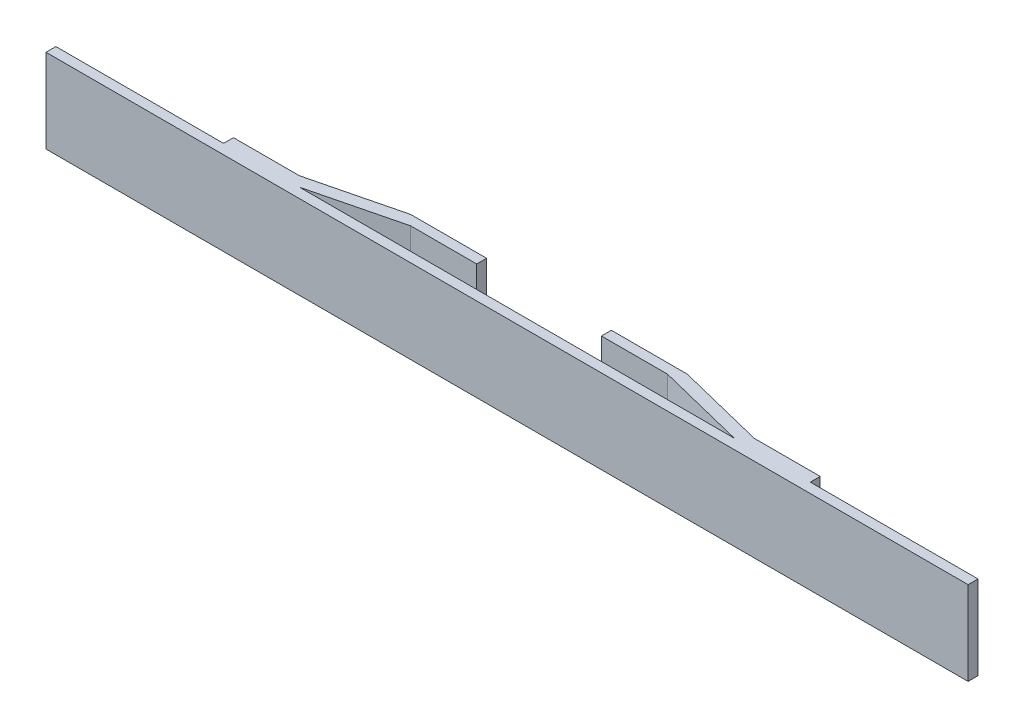
ISO-10303-21;
HEADER;
FILE_DESCRIPTION(('STEP AP214'),'2;1');
FILE_NAME('part.step','',(''),(''),'','','');
FILE_SCHEMA(('AUTOMOTIVE_DESIGN { 1 0 10303 214 1 1 1 1 }'));
ENDSEC;
DATA;
#1=APPLICATION_CONTEXT('core data for automotive mechanical design processes');
#2=APPLICATION_PROTOCOL_DEFINITION('international standard','automotive_design',2000,#1);
#3=PRODUCT_CONTEXT('',#1,'mechanical');
#4=PRODUCT('Part','Part','',(#3));
#5=PRODUCT_RELATED_PRODUCT_CATEGORY('part','',(#4));
#6=PRODUCT_DEFINITION_FORMATION('','',#4);
#7=PRODUCT_DEFINITION_CONTEXT('part definition',#1,'design');
#8=PRODUCT_DEFINITION('design','',#6,#7);
#9=PRODUCT_DEFINITION_SHAPE('','',#8);
#10=(LENGTH_UNIT() NAMED_UNIT(*) SI_UNIT(.MILLI.,.METRE.));
#11=(NAMED_UNIT(*) PLANE_ANGLE_UNIT() SI_UNIT($,.RADIAN.));
#12=(NAMED_UNIT(*) SI_UNIT($,.STERADIAN.) SOLID_ANGLE_UNIT());
#13=UNCERTAINTY_MEASURE_WITH_UNIT(LENGTH_MEASURE(1.E-05),#10,'distance_accuracy_value','');
#14=(GEOMETRIC_REPRESENTATION_CONTEXT(3) GLOBAL_UNCERTAINTY_ASSIGNED_CONTEXT((#13)) GLOBAL_UNIT_ASSIGNED_CONTEXT((#10,
#11,#12)) REPRESENTATION_CONTEXT('',''));
#15=CARTESIAN_POINT('',(0.,0.,0.));
#16=DIRECTION('',(0.,0.,1.));
#17=DIRECTION('',(1.,0.,0.));
#18=AXIS2_PLACEMENT_3D('',#15,#16,#17);
#19=CARTESIAN_POINT('',(-13.3330218068536,-14.8364485981308,9.7));
#20=DIRECTION('',(0.,0.,1.));
#21=DIRECTION('',(1.,0.,0.));
#22=AXIS2_PLACEMENT_3D('',#19,#20,#21);
#23=PLANE('',#22);
#24=DIRECTION('',(0.,1.,0.));
#25=VECTOR('',#24,1.);
#26=CARTESIAN_POINT('',(37.4669781931464,10.5635514018692,9.7));
#27=LINE('',#26,#25);
#28=CARTESIAN_POINT('',(37.4669781931464,-14.8364485981308,9.7));
#29=VERTEX_POINT('',#28);
#30=CARTESIAN_POINT('',(37.4669781931464,10.5635514018692,9.7));
#31=VERTEX_POINT('',#30);
#32=EDGE_CURVE('E239',#29,#31,#27,.T.);
#33=ORIENTED_EDGE('',*,*,#32,.F.);
#34=DIRECTION('',(1.,0.,0.));
#35=VECTOR('',#34,1.);
#36=CARTESIAN_POINT('',(-13.3330218068536,-14.8364485981308,9.7));
#37=LINE('',#36,#35);
#38=CARTESIAN_POINT('',(-13.3330218068536,-14.8364485981308,9.7));
#39=VERTEX_POINT('',#38);
#40=EDGE_CURVE('E198',#39,#29,#37,.T.);
#41=ORIENTED_EDGE('',*,*,#40,.F.);
#42=DIRECTION('',(0.,1.,0.));
#43=VECTOR('',#42,1.);
#44=CARTESIAN_POINT('',(-13.3330218068536,-14.8364485981308,9.7));
#45=LINE('',#44,#43);
#46=CARTESIAN_POINT('',(-13.3330218068536,10.5635514018692,9.7));
#47=VERTEX_POINT('',#46);
#48=EDGE_CURVE('E196',#39,#47,#45,.T.);
#49=ORIENTED_EDGE('',*,*,#48,.T.);
#50=DIRECTION('',(1.,0.,0.));
#51=VECTOR('',#50,1.);
#52=CARTESIAN_POINT('',(-13.3330218068536,10.5635514018692,9.7));
#53=LINE('',#52,#51);
#54=EDGE_CURVE('E186',#47,#31,#53,.T.);
#55=ORIENTED_EDGE('',*,*,#54,.T.);
#56=EDGE_LOOP('',(#33,#41,#49,#55));
#57=FACE_BOUND('',#56,.T.);
#58=ADVANCED_FACE('F34',(#57),#23,.F.);
#59=CARTESIAN_POINT('',(60.4669781931464,-14.8364485981308,9.7));
#60=VERTEX_POINT('',#59);
#61=CARTESIAN_POINT('',(192.266978193146,-14.8364485981308,9.7));
#62=VERTEX_POINT('',#61);
#63=EDGE_CURVE('E206',#60,#62,#37,.T.);
#64=ORIENTED_EDGE('',*,*,#63,.F.);
#65=DIRECTION('',(0.,1.,0.));
#66=VECTOR('',#65,1.);
#67=CARTESIAN_POINT('',(60.4669781931464,-14.8364485981308,9.7));
#68=LINE('',#67,#66);
#69=CARTESIAN_POINT('',(60.4669781931464,10.5635514018692,9.7));
#70=VERTEX_POINT('',#69);
#71=EDGE_CURVE('E281',#60,#70,#68,.T.);
#72=ORIENTED_EDGE('',*,*,#71,.T.);
#73=CARTESIAN_POINT('',(192.266978193146,10.5635514018692,9.7));
#74=VERTEX_POINT('',#73);
#75=EDGE_CURVE('E202',#70,#74,#53,.T.);
#76=ORIENTED_EDGE('',*,*,#75,.T.);
#77=DIRECTION('',(0.,1.,0.));
#78=VECTOR('',#77,1.);
#79=CARTESIAN_POINT('',(192.266978193146,-14.8364485981308,9.7));
#80=LINE('',#79,#78);
#81=EDGE_CURVE('E249',#62,#74,#80,.T.);
#82=ORIENTED_EDGE('',*,*,#81,.F.);
#83=EDGE_LOOP('',(#64,#72,#76,#82));
#84=FACE_BOUND('',#83,.T.);
#85=ADVANCED_FACE('F334',(#84),#23,.F.);
#86=DIRECTION('',(0.,-1.,0.));
#87=VECTOR('',#86,1.);
#88=CARTESIAN_POINT('',(215.266978193146,10.5635514018692,9.7));
#89=LINE('',#88,#87);
#90=CARTESIAN_POINT('',(215.266978193146,10.5635514018692,9.7));
#91=VERTEX_POINT('',#90);
#92=CARTESIAN_POINT('',(215.266978193146,-14.8364485981308,9.7));
#93=VERTEX_POINT('',#92);
#94=EDGE_CURVE('E218',#91,#93,#89,.T.);
#95=ORIENTED_EDGE('',*,*,#94,.F.);
#96=CARTESIAN_POINT('',(266.066978193146,10.5635514018692,9.69999999999999));
#97=VERTEX_POINT('',#96);
#98=EDGE_CURVE('E203',#91,#97,#53,.T.);
#99=ORIENTED_EDGE('',*,*,#98,.T.);
#100=DIRECTION('',(0.,1.,0.));
#101=VECTOR('',#100,1.);
#102=CARTESIAN_POINT('',(266.066978193146,-14.8364485981308,9.69999999999999));
#103=LINE('',#102,#101);
#104=CARTESIAN_POINT('',(266.066978193146,-14.8364485981308,9.69999999999999));
#105=VERTEX_POINT('',#104);
#106=EDGE_CURVE('E193',#105,#97,#103,.T.);
#107=ORIENTED_EDGE('',*,*,#106,.F.);
#108=EDGE_CURVE('E201',#93,#105,#37,.T.);
#109=ORIENTED_EDGE('',*,*,#108,.F.);
#110=EDGE_LOOP('',(#95,#99,#107,#109));
#111=FACE_BOUND('',#110,.T.);
#112=ADVANCED_FACE('F330',(#111),#23,.F.);
#113=CARTESIAN_POINT('',(-26.0330218068536,-14.8364485981308,12.7));
#114=DIRECTION('',(0.,1.,0.));
#115=DIRECTION('',(-1.,0.,0.));
#116=AXIS2_PLACEMENT_3D('',#113,#114,#115);
#117=PLANE('',#116);
#118=DIRECTION('',(1.,0.,0.));
#119=VECTOR('',#118,1.);
#120=CARTESIAN_POINT('',(-26.0330218068536,-14.8364485981308,12.7));
#121=LINE('',#120,#119);
#122=CARTESIAN_POINT('',(-13.3330218068536,-14.8364485981308,12.7));
#123=VERTEX_POINT('',#122);
#124=CARTESIAN_POINT('',(266.066978193146,-14.8364485981308,12.7));
#125=VERTEX_POINT('',#124);
#126=EDGE_CURVE('E191',#123,#125,#121,.T.);
#127=ORIENTED_EDGE('',*,*,#126,.F.);
#128=DIRECTION('',(0.,0.,1.));
#129=VECTOR('',#128,1.);
#130=CARTESIAN_POINT('',(-13.3330218068536,-14.8364485981308,0.));
#131=LINE('',#130,#129);
#132=EDGE_CURVE('E174',#39,#123,#131,.T.);
#133=ORIENTED_EDGE('',*,*,#132,.F.);
#134=ORIENTED_EDGE('',*,*,#40,.T.);
#135=DIRECTION('',(0.,0.,1.));
#136=VECTOR('',#135,1.);
#137=CARTESIAN_POINT('',(37.4669781931464,-14.8364485981308,0.));
#138=LINE('',#137,#136);
#139=CARTESIAN_POINT('',(37.4669781931464,-14.8364485981308,6.7));
#140=VERTEX_POINT('',#139);
#141=EDGE_CURVE('E236',#140,#29,#138,.T.);
#142=ORIENTED_EDGE('',*,*,#141,.F.);
#143=DIRECTION('',(1.,0.,0.));
#144=VECTOR('',#143,1.);
#145=CARTESIAN_POINT('',(37.4669781931464,-14.8364485981308,6.7));
#146=LINE('',#145,#144);
#147=CARTESIAN_POINT('',(57.4669781931464,-14.8364485981308,6.7));
#148=VERTEX_POINT('',#147);
#149=EDGE_CURVE('E310',#140,#148,#146,.T.);
#150=ORIENTED_EDGE('',*,*,#149,.T.);
#151=DIRECTION('',(0.970563929002576,0.,-0.24084364164138));
#152=VECTOR('',#151,1.);
#153=CARTESIAN_POINT('',(57.4669781931464,-14.8364485981308,6.7));
#154=LINE('',#153,#152);
#155=CARTESIAN_POINT('',(84.4669781931464,-14.8364485981308,0.));
#156=VERTEX_POINT('',#155);
#157=EDGE_CURVE('E306',#148,#156,#154,.T.);
#158=ORIENTED_EDGE('',*,*,#157,.T.);
#159=DIRECTION('',(-1.,0.,0.));
#160=VECTOR('',#159,1.);
#161=CARTESIAN_POINT('',(37.4669781931464,-14.8364485981308,0.));
#162=LINE('',#161,#160);
#163=CARTESIAN_POINT('',(107.466978193146,-14.8364485981308,0.));
#164=VERTEX_POINT('',#163);
#165=EDGE_CURVE('E238',#164,#156,#162,.T.);
#166=ORIENTED_EDGE('',*,*,#165,.F.);
#167=DIRECTION('',(0.,0.,1.));
#168=VECTOR('',#167,1.);
#169=CARTESIAN_POINT('',(107.466978193146,-14.8364485981308,0.));
#170=LINE('',#169,#168);
#171=CARTESIAN_POINT('',(107.466978193146,-14.8364485981308,3.));
#172=VERTEX_POINT('',#171);
#173=EDGE_CURVE('E233',#164,#172,#170,.T.);
#174=ORIENTED_EDGE('',*,*,#173,.T.);
#175=DIRECTION('',(-1.,0.,0.));
#176=VECTOR('',#175,1.);
#177=CARTESIAN_POINT('',(107.466978193146,-14.8364485981308,3.));
#178=LINE('',#177,#176);
#179=CARTESIAN_POINT('',(87.4669781931464,-14.8364485981308,3.));
#180=VERTEX_POINT('',#179);
#181=EDGE_CURVE('E49',#172,#180,#178,.T.);
#182=ORIENTED_EDGE('',*,*,#181,.T.);
#183=DIRECTION('',(-0.970563929002577,0.,0.24084364164138));
#184=VECTOR('',#183,1.);
#185=CARTESIAN_POINT('',(87.4669781931464,-14.8364485981308,3.));
#186=LINE('',#185,#184);
#187=EDGE_CURVE('E289',#180,#60,#186,.T.);
#188=ORIENTED_EDGE('',*,*,#187,.T.);
#189=ORIENTED_EDGE('',*,*,#63,.T.);
#190=DIRECTION('',(-0.970563929002576,0.,-0.24084364164138));
#191=VECTOR('',#190,1.);
#192=CARTESIAN_POINT('',(192.266978193146,-14.8364485981308,9.7));
#193=LINE('',#192,#191);
#194=CARTESIAN_POINT('',(165.266978193146,-14.8364485981308,3.));
#195=VERTEX_POINT('',#194);
#196=EDGE_CURVE('E259',#62,#195,#193,.T.);
#197=ORIENTED_EDGE('',*,*,#196,.T.);
#198=DIRECTION('',(-1.,0.,0.));
#199=VECTOR('',#198,1.);
#200=CARTESIAN_POINT('',(165.266978193146,-14.8364485981308,3.));
#201=LINE('',#200,#199);
#202=CARTESIAN_POINT('',(145.266978193146,-14.8364485981308,3.));
#203=VERTEX_POINT('',#202);
#204=EDGE_CURVE('E253',#195,#203,#201,.T.);
#205=ORIENTED_EDGE('',*,*,#204,.T.);
#206=DIRECTION('',(0.,0.,1.));
#207=VECTOR('',#206,1.);
#208=CARTESIAN_POINT('',(145.266978193146,-14.8364485981308,0.));
#209=LINE('',#208,#207);
#210=CARTESIAN_POINT('',(145.266978193146,-14.8364485981308,0.));
#211=VERTEX_POINT('',#210);
#212=EDGE_CURVE('E214',#211,#203,#209,.T.);
#213=ORIENTED_EDGE('',*,*,#212,.F.);
#214=DIRECTION('',(-1.,0.,0.));
#215=VECTOR('',#214,1.);
#216=CARTESIAN_POINT('',(145.266978193146,-14.8364485981308,0.));
#217=LINE('',#216,#215);
#218=CARTESIAN_POINT('',(168.266978193146,-14.8364485981308,0.));
#219=VERTEX_POINT('',#218);
#220=EDGE_CURVE('E217',#219,#211,#217,.T.);
#221=ORIENTED_EDGE('',*,*,#220,.F.);
#222=DIRECTION('',(0.970563929002576,0.,0.24084364164138));
#223=VECTOR('',#222,1.);
#224=CARTESIAN_POINT('',(195.266978193146,-14.8364485981308,6.7));
#225=LINE('',#224,#223);
#226=CARTESIAN_POINT('',(195.266978193146,-14.8364485981308,6.7));
#227=VERTEX_POINT('',#226);
#228=EDGE_CURVE('E277',#219,#227,#225,.T.);
#229=ORIENTED_EDGE('',*,*,#228,.T.);
#230=DIRECTION('',(1.,0.,0.));
#231=VECTOR('',#230,1.);
#232=CARTESIAN_POINT('',(215.266978193146,-14.8364485981308,6.69999999999999));
#233=LINE('',#232,#231);
#234=CARTESIAN_POINT('',(215.266978193146,-14.8364485981308,6.69999999999999));
#235=VERTEX_POINT('',#234);
#236=EDGE_CURVE('E271',#227,#235,#233,.T.);
#237=ORIENTED_EDGE('',*,*,#236,.T.);
#238=DIRECTION('',(0.,0.,1.));
#239=VECTOR('',#238,1.);
#240=CARTESIAN_POINT('',(215.266978193146,-14.8364485981308,0.));
#241=LINE('',#240,#239);
#242=EDGE_CURVE('E212',#235,#93,#241,.T.);
#243=ORIENTED_EDGE('',*,*,#242,.T.);
#244=ORIENTED_EDGE('',*,*,#108,.T.);
#245=DIRECTION('',(0.,0.,1.));
#246=VECTOR('',#245,1.);
#247=CARTESIAN_POINT('',(266.066978193146,-14.8364485981308,0.));
#248=LINE('',#247,#246);
#249=EDGE_CURVE('E318',#105,#125,#248,.T.);
#250=ORIENTED_EDGE('',*,*,#249,.T.);
#251=EDGE_LOOP('',(#127,#133,#134,#142,#150,#158,#166,#174,#182,#188,#189,#197,#205,#213,#221,
#229,#237,#243,#244,#250));
#252=FACE_BOUND('',#251,.T.);
#253=ADVANCED_FACE('F36',(#252),#117,.F.);
#254=CARTESIAN_POINT('',(-26.0330218068536,10.5635514018692,12.7));
#255=DIRECTION('',(0.,1.,0.));
#256=DIRECTION('',(0.,0.,1.));
#257=AXIS2_PLACEMENT_3D('',#254,#255,#256);
#258=PLANE('',#257);
#259=DIRECTION('',(0.,0.,1.));
#260=VECTOR('',#259,1.);
#261=CARTESIAN_POINT('',(-13.3330218068536,10.5635514018692,0.));
#262=LINE('',#261,#260);
#263=CARTESIAN_POINT('',(-13.3330218068536,10.5635514018692,12.7));
#264=VERTEX_POINT('',#263);
#265=EDGE_CURVE('E171',#47,#264,#262,.T.);
#266=ORIENTED_EDGE('',*,*,#265,.T.);
#267=DIRECTION('',(1.,0.,0.));
#268=VECTOR('',#267,1.);
#269=CARTESIAN_POINT('',(-26.0330218068536,10.5635514018692,12.7));
#270=LINE('',#269,#268);
#271=CARTESIAN_POINT('',(266.066978193146,10.5635514018692,12.7));
#272=VERTEX_POINT('',#271);
#273=EDGE_CURVE('E184',#264,#272,#270,.T.);
#274=ORIENTED_EDGE('',*,*,#273,.T.);
#275=DIRECTION('',(0.,0.,1.));
#276=VECTOR('',#275,1.);
#277=CARTESIAN_POINT('',(266.066978193146,10.5635514018692,0.));
#278=LINE('',#277,#276);
#279=EDGE_CURVE('E187',#97,#272,#278,.T.);
#280=ORIENTED_EDGE('',*,*,#279,.F.);
#281=ORIENTED_EDGE('',*,*,#98,.F.);
#282=DIRECTION('',(0.,0.,1.));
#283=VECTOR('',#282,1.);
#284=CARTESIAN_POINT('',(215.266978193146,10.5635514018692,0.));
#285=LINE('',#284,#283);
#286=CARTESIAN_POINT('',(215.266978193146,10.5635514018692,6.69999999999999));
#287=VERTEX_POINT('',#286);
#288=EDGE_CURVE('E210',#287,#91,#285,.T.);
#289=ORIENTED_EDGE('',*,*,#288,.F.);
#290=DIRECTION('',(1.,0.,0.));
#291=VECTOR('',#290,1.);
#292=CARTESIAN_POINT('',(215.266978193146,10.5635514018692,6.69999999999999));
#293=LINE('',#292,#291);
#294=CARTESIAN_POINT('',(195.266978193146,10.5635514018692,6.7));
#295=VERTEX_POINT('',#294);
#296=EDGE_CURVE('E275',#295,#287,#293,.T.);
#297=ORIENTED_EDGE('',*,*,#296,.F.);
#298=DIRECTION('',(0.970563929002576,0.,0.24084364164138));
#299=VECTOR('',#298,1.);
#300=CARTESIAN_POINT('',(195.266978193146,10.5635514018692,6.7));
#301=LINE('',#300,#299);
#302=CARTESIAN_POINT('',(168.266978193146,10.5635514018692,0.));
#303=VERTEX_POINT('',#302);
#304=EDGE_CURVE('E278',#303,#295,#301,.T.);
#305=ORIENTED_EDGE('',*,*,#304,.F.);
#306=DIRECTION('',(1.,0.,0.));
#307=VECTOR('',#306,1.);
#308=CARTESIAN_POINT('',(145.266978193146,10.5635514018692,0.));
#309=LINE('',#308,#307);
#310=CARTESIAN_POINT('',(145.266978193146,10.5635514018692,0.));
#311=VERTEX_POINT('',#310);
#312=EDGE_CURVE('E224',#311,#303,#309,.T.);
#313=ORIENTED_EDGE('',*,*,#312,.F.);
#314=DIRECTION('',(0.,0.,1.));
#315=VECTOR('',#314,1.);
#316=CARTESIAN_POINT('',(145.266978193146,10.5635514018692,0.));
#317=LINE('',#316,#315);
#318=CARTESIAN_POINT('',(145.266978193146,10.5635514018692,3.));
#319=VERTEX_POINT('',#318);
#320=EDGE_CURVE('E207',#311,#319,#317,.T.);
#321=ORIENTED_EDGE('',*,*,#320,.T.);
#322=DIRECTION('',(-1.,0.,0.));
#323=VECTOR('',#322,1.);
#324=CARTESIAN_POINT('',(165.266978193146,10.5635514018692,3.));
#325=LINE('',#324,#323);
#326=CARTESIAN_POINT('',(165.266978193146,10.5635514018692,3.));
#327=VERTEX_POINT('',#326);
#328=EDGE_CURVE('E257',#327,#319,#325,.T.);
#329=ORIENTED_EDGE('',*,*,#328,.F.);
#330=DIRECTION('',(-0.970563929002576,0.,-0.24084364164138));
#331=VECTOR('',#330,1.);
#332=CARTESIAN_POINT('',(192.266978193146,10.5635514018692,9.7));
#333=LINE('',#332,#331);
#334=EDGE_CURVE('E260',#74,#327,#333,.T.);
#335=ORIENTED_EDGE('',*,*,#334,.F.);
#336=ORIENTED_EDGE('',*,*,#75,.F.);
#337=DIRECTION('',(-0.970563929002577,0.,0.24084364164138));
#338=VECTOR('',#337,1.);
#339=CARTESIAN_POINT('',(87.4669781931464,10.5635514018692,3.));
#340=LINE('',#339,#338);
#341=CARTESIAN_POINT('',(87.4669781931464,10.5635514018692,3.));
#342=VERTEX_POINT('',#341);
#343=EDGE_CURVE('E293',#342,#70,#340,.T.);
#344=ORIENTED_EDGE('',*,*,#343,.F.);
#345=DIRECTION('',(-1.,0.,0.));
#346=VECTOR('',#345,1.);
#347=CARTESIAN_POINT('',(107.466978193146,10.5635514018692,3.));
#348=LINE('',#347,#346);
#349=CARTESIAN_POINT('',(107.466978193146,10.5635514018692,3.));
#350=VERTEX_POINT('',#349);
#351=EDGE_CURVE('E296',#350,#342,#348,.T.);
#352=ORIENTED_EDGE('',*,*,#351,.F.);
#353=DIRECTION('',(0.,0.,1.));
#354=VECTOR('',#353,1.);
#355=CARTESIAN_POINT('',(107.466978193146,10.5635514018692,0.));
#356=LINE('',#355,#354);
#357=CARTESIAN_POINT('',(107.466978193146,10.5635514018692,0.));
#358=VERTEX_POINT('',#357);
#359=EDGE_CURVE('E230',#358,#350,#356,.T.);
#360=ORIENTED_EDGE('',*,*,#359,.F.);
#361=DIRECTION('',(1.,0.,0.));
#362=VECTOR('',#361,1.);
#363=CARTESIAN_POINT('',(37.4669781931464,10.5635514018692,0.));
#364=LINE('',#363,#362);
#365=CARTESIAN_POINT('',(84.4669781931464,10.5635514018692,0.));
#366=VERTEX_POINT('',#365);
#367=EDGE_CURVE('E242',#366,#358,#364,.T.);
#368=ORIENTED_EDGE('',*,*,#367,.F.);
#369=DIRECTION('',(0.970563929002576,0.,-0.24084364164138));
#370=VECTOR('',#369,1.);
#371=CARTESIAN_POINT('',(57.4669781931464,10.5635514018692,6.7));
#372=LINE('',#371,#370);
#373=CARTESIAN_POINT('',(57.4669781931464,10.5635514018692,6.7));
#374=VERTEX_POINT('',#373);
#375=EDGE_CURVE('E57',#374,#366,#372,.T.);
#376=ORIENTED_EDGE('',*,*,#375,.F.);
#377=DIRECTION('',(1.,0.,0.));
#378=VECTOR('',#377,1.);
#379=CARTESIAN_POINT('',(37.4669781931464,10.5635514018692,6.7));
#380=LINE('',#379,#378);
#381=CARTESIAN_POINT('',(37.4669781931464,10.5635514018692,6.7));
#382=VERTEX_POINT('',#381);
#383=EDGE_CURVE('E311',#382,#374,#380,.T.);
#384=ORIENTED_EDGE('',*,*,#383,.F.);
#385=DIRECTION('',(0.,0.,1.));
#386=VECTOR('',#385,1.);
#387=CARTESIAN_POINT('',(37.4669781931464,10.5635514018692,0.));
#388=LINE('',#387,#386);
#389=EDGE_CURVE('E222',#382,#31,#388,.T.);
#390=ORIENTED_EDGE('',*,*,#389,.T.);
#391=ORIENTED_EDGE('',*,*,#54,.F.);
#392=EDGE_LOOP('',(#266,#274,#280,#281,#289,#297,#305,#313,#321,#329,#335,#336,#344,#352,#360,
#368,#376,#384,#390,#391));
#393=FACE_BOUND('',#392,.T.);
#394=ADVANCED_FACE('F182',(#393),#258,.T.);
#395=CARTESIAN_POINT('',(0.,0.,12.7));
#396=DIRECTION('',(0.,0.,1.));
#397=DIRECTION('',(1.,0.,0.));
#398=AXIS2_PLACEMENT_3D('',#395,#396,#397);
#399=PLANE('',#398);
#400=ORIENTED_EDGE('',*,*,#273,.F.);
#401=DIRECTION('',(0.,-1.,0.));
#402=VECTOR('',#401,1.);
#403=CARTESIAN_POINT('',(-13.3330218068536,-14.8364485981308,12.7));
#404=LINE('',#403,#402);
#405=EDGE_CURVE('E11',#264,#123,#404,.T.);
#406=ORIENTED_EDGE('',*,*,#405,.T.);
#407=ORIENTED_EDGE('',*,*,#126,.T.);
#408=DIRECTION('',(0.,-1.,0.));
#409=VECTOR('',#408,1.);
#410=CARTESIAN_POINT('',(266.066978193146,0.,12.7));
#411=LINE('',#410,#409);
#412=EDGE_CURVE('E42',#125,#272,#411,.F.);
#413=ORIENTED_EDGE('',*,*,#412,.T.);
#414=EDGE_LOOP('',(#400,#406,#407,#413));
#415=FACE_BOUND('',#414,.T.);
#416=ADVANCED_FACE('F190',(#415),#399,.T.);
#417=CARTESIAN_POINT('',(145.266978193146,10.5635514018692,0.));
#418=DIRECTION('',(1.,0.,0.));
#419=DIRECTION('',(0.,0.,-1.));
#420=AXIS2_PLACEMENT_3D('',#417,#418,#419);
#421=PLANE('',#420);
#422=ORIENTED_EDGE('',*,*,#212,.T.);
#423=DIRECTION('',(0.,1.,0.));
#424=VECTOR('',#423,1.);
#425=CARTESIAN_POINT('',(145.266978193146,-14.8364485981308,3.));
#426=LINE('',#425,#424);
#427=EDGE_CURVE('E243',#203,#319,#426,.T.);
#428=ORIENTED_EDGE('',*,*,#427,.T.);
#429=ORIENTED_EDGE('',*,*,#320,.F.);
#430=DIRECTION('',(0.,1.,0.));
#431=VECTOR('',#430,1.);
#432=CARTESIAN_POINT('',(145.266978193146,10.5635514018692,0.));
#433=LINE('',#432,#431);
#434=EDGE_CURVE('E221',#211,#311,#433,.T.);
#435=ORIENTED_EDGE('',*,*,#434,.F.);
#436=EDGE_LOOP('',(#422,#428,#429,#435));
#437=FACE_BOUND('',#436,.T.);
#438=ADVANCED_FACE('F347',(#437),#421,.F.);
#439=CARTESIAN_POINT('',(215.266978193146,10.5635514018692,0.));
#440=DIRECTION('',(-1.,0.,0.));
#441=DIRECTION('',(0.,0.,1.));
#442=AXIS2_PLACEMENT_3D('',#439,#440,#441);
#443=PLANE('',#442);
#444=ORIENTED_EDGE('',*,*,#242,.F.);
#445=DIRECTION('',(0.,1.,0.));
#446=VECTOR('',#445,1.);
#447=CARTESIAN_POINT('',(215.266978193146,-14.8364485981308,6.69999999999999));
#448=LINE('',#447,#446);
#449=EDGE_CURVE('E263',#235,#287,#448,.T.);
#450=ORIENTED_EDGE('',*,*,#449,.T.);
#451=ORIENTED_EDGE('',*,*,#288,.T.);
#452=ORIENTED_EDGE('',*,*,#94,.T.);
#453=EDGE_LOOP('',(#444,#450,#451,#452));
#454=FACE_BOUND('',#453,.T.);
#455=ADVANCED_FACE('F357',(#454),#443,.F.);
#456=CARTESIAN_POINT('',(0.,0.,0.));
#457=DIRECTION('',(0.,0.,1.));
#458=DIRECTION('',(1.,0.,0.));
#459=AXIS2_PLACEMENT_3D('',#456,#457,#458);
#460=PLANE('',#459);
#461=ORIENTED_EDGE('',*,*,#312,.T.);
#462=DIRECTION('',(0.,1.,0.));
#463=VECTOR('',#462,1.);
#464=CARTESIAN_POINT('',(168.266978193146,-14.8364485981308,0.));
#465=LINE('',#464,#463);
#466=EDGE_CURVE('E268',#219,#303,#465,.T.);
#467=ORIENTED_EDGE('',*,*,#466,.F.);
#468=ORIENTED_EDGE('',*,*,#220,.T.);
#469=ORIENTED_EDGE('',*,*,#434,.T.);
#470=EDGE_LOOP('',(#461,#467,#468,#469));
#471=FACE_BOUND('',#470,.T.);
#472=ADVANCED_FACE('F366',(#471),#460,.F.);
#473=CARTESIAN_POINT('',(37.4669781931464,10.5635514018692,0.));
#474=DIRECTION('',(1.,0.,0.));
#475=DIRECTION('',(0.,0.,-1.));
#476=AXIS2_PLACEMENT_3D('',#473,#474,#475);
#477=PLANE('',#476);
#478=ORIENTED_EDGE('',*,*,#389,.F.);
#479=DIRECTION('',(0.,1.,0.));
#480=VECTOR('',#479,1.);
#481=CARTESIAN_POINT('',(37.4669781931464,-14.8364485981308,6.7));
#482=LINE('',#481,#480);
#483=EDGE_CURVE('E303',#140,#382,#482,.T.);
#484=ORIENTED_EDGE('',*,*,#483,.F.);
#485=ORIENTED_EDGE('',*,*,#141,.T.);
#486=ORIENTED_EDGE('',*,*,#32,.T.);
#487=EDGE_LOOP('',(#478,#484,#485,#486));
#488=FACE_BOUND('',#487,.T.);
#489=ADVANCED_FACE('F368',(#488),#477,.F.);
#490=CARTESIAN_POINT('',(107.466978193146,10.5635514018692,0.));
#491=DIRECTION('',(-1.,0.,0.));
#492=DIRECTION('',(0.,0.,1.));
#493=AXIS2_PLACEMENT_3D('',#490,#491,#492);
#494=PLANE('',#493);
#495=ORIENTED_EDGE('',*,*,#359,.T.);
#496=DIRECTION('',(0.,1.,0.));
#497=VECTOR('',#496,1.);
#498=CARTESIAN_POINT('',(107.466978193146,-14.8364485981308,3.));
#499=LINE('',#498,#497);
#500=EDGE_CURVE('E286',#172,#350,#499,.T.);
#501=ORIENTED_EDGE('',*,*,#500,.F.);
#502=ORIENTED_EDGE('',*,*,#173,.F.);
#503=DIRECTION('',(0.,-1.,0.));
#504=VECTOR('',#503,1.);
#505=CARTESIAN_POINT('',(107.466978193146,10.5635514018692,0.));
#506=LINE('',#505,#504);
#507=EDGE_CURVE('E246',#358,#164,#506,.T.);
#508=ORIENTED_EDGE('',*,*,#507,.F.);
#509=EDGE_LOOP('',(#495,#501,#502,#508));
#510=FACE_BOUND('',#509,.T.);
#511=ADVANCED_FACE('F374',(#510),#494,.F.);
#512=CARTESIAN_POINT('',(0.,0.,0.));
#513=DIRECTION('',(0.,0.,1.));
#514=DIRECTION('',(1.,0.,0.));
#515=AXIS2_PLACEMENT_3D('',#512,#513,#514);
#516=PLANE('',#515);
#517=ORIENTED_EDGE('',*,*,#165,.T.);
#518=DIRECTION('',(0.,1.,0.));
#519=VECTOR('',#518,1.);
#520=CARTESIAN_POINT('',(84.4669781931464,-14.8364485981308,0.));
#521=LINE('',#520,#519);
#522=EDGE_CURVE('E299',#156,#366,#521,.T.);
#523=ORIENTED_EDGE('',*,*,#522,.T.);
#524=ORIENTED_EDGE('',*,*,#367,.T.);
#525=ORIENTED_EDGE('',*,*,#507,.T.);
#526=EDGE_LOOP('',(#517,#523,#524,#525));
#527=FACE_BOUND('',#526,.T.);
#528=ADVANCED_FACE('F420',(#527),#516,.F.);
#529=CARTESIAN_POINT('',(215.266978193146,-14.8364485981308,6.69999999999999));
#530=DIRECTION('',(0.,0.,1.));
#531=DIRECTION('',(1.,0.,0.));
#532=AXIS2_PLACEMENT_3D('',#529,#530,#531);
#533=PLANE('',#532);
#534=ORIENTED_EDGE('',*,*,#296,.T.);
#535=ORIENTED_EDGE('',*,*,#449,.F.);
#536=ORIENTED_EDGE('',*,*,#236,.F.);
#537=DIRECTION('',(0.,1.,0.));
#538=VECTOR('',#537,1.);
#539=CARTESIAN_POINT('',(195.266978193146,-14.8364485981308,6.7));
#540=LINE('',#539,#538);
#541=EDGE_CURVE('E270',#227,#295,#540,.T.);
#542=ORIENTED_EDGE('',*,*,#541,.T.);
#543=EDGE_LOOP('',(#534,#535,#536,#542));
#544=FACE_BOUND('',#543,.T.);
#545=ADVANCED_FACE('F361',(#544),#533,.F.);
#546=CARTESIAN_POINT('',(195.266978193146,-14.8364485981308,6.7));
#547=DIRECTION('',(-0.24084364164138,0.,0.970563929002577));
#548=DIRECTION('',(0.970563929002577,0.,0.24084364164138));
#549=AXIS2_PLACEMENT_3D('',#546,#547,#548);
#550=PLANE('',#549);
#551=ORIENTED_EDGE('',*,*,#304,.T.);
#552=ORIENTED_EDGE('',*,*,#541,.F.);
#553=ORIENTED_EDGE('',*,*,#228,.F.);
#554=ORIENTED_EDGE('',*,*,#466,.T.);
#555=EDGE_LOOP('',(#551,#552,#553,#554));
#556=FACE_BOUND('',#555,.T.);
#557=ADVANCED_FACE('F363',(#556),#550,.F.);
#558=CARTESIAN_POINT('',(165.266978193146,-14.8364485981308,3.));
#559=DIRECTION('',(0.,0.,-1.));
#560=DIRECTION('',(-1.,0.,0.));
#561=AXIS2_PLACEMENT_3D('',#558,#559,#560);
#562=PLANE('',#561);
#563=ORIENTED_EDGE('',*,*,#328,.T.);
#564=ORIENTED_EDGE('',*,*,#427,.F.);
#565=ORIENTED_EDGE('',*,*,#204,.F.);
#566=DIRECTION('',(0.,1.,0.));
#567=VECTOR('',#566,1.);
#568=CARTESIAN_POINT('',(165.266978193146,-14.8364485981308,3.));
#569=LINE('',#568,#567);
#570=EDGE_CURVE('E252',#195,#327,#569,.T.);
#571=ORIENTED_EDGE('',*,*,#570,.T.);
#572=EDGE_LOOP('',(#563,#564,#565,#571));
#573=FACE_BOUND('',#572,.T.);
#574=ADVANCED_FACE('F344',(#573),#562,.F.);
#575=CARTESIAN_POINT('',(192.266978193146,-14.8364485981308,9.7));
#576=DIRECTION('',(0.24084364164138,0.,-0.970563929002577));
#577=DIRECTION('',(-0.970563929002577,0.,-0.24084364164138));
#578=AXIS2_PLACEMENT_3D('',#575,#576,#577);
#579=PLANE('',#578);
#580=ORIENTED_EDGE('',*,*,#334,.T.);
#581=ORIENTED_EDGE('',*,*,#570,.F.);
#582=ORIENTED_EDGE('',*,*,#196,.F.);
#583=ORIENTED_EDGE('',*,*,#81,.T.);
#584=EDGE_LOOP('',(#580,#581,#582,#583));
#585=FACE_BOUND('',#584,.T.);
#586=ADVANCED_FACE('F340',(#585),#579,.F.);
#587=CARTESIAN_POINT('',(57.4669781931464,-14.8364485981308,6.7));
#588=DIRECTION('',(0.24084364164138,0.,0.970563929002577));
#589=DIRECTION('',(0.970563929002577,0.,-0.24084364164138));
#590=AXIS2_PLACEMENT_3D('',#587,#588,#589);
#591=PLANE('',#590);
#592=ORIENTED_EDGE('',*,*,#375,.T.);
#593=ORIENTED_EDGE('',*,*,#522,.F.);
#594=ORIENTED_EDGE('',*,*,#157,.F.);
#595=DIRECTION('',(0.,1.,0.));
#596=VECTOR('',#595,1.);
#597=CARTESIAN_POINT('',(57.4669781931464,-14.8364485981308,6.7));
#598=LINE('',#597,#596);
#599=EDGE_CURVE('E305',#148,#374,#598,.T.);
#600=ORIENTED_EDGE('',*,*,#599,.T.);
#601=EDGE_LOOP('',(#592,#593,#594,#600));
#602=FACE_BOUND('',#601,.T.);
#603=ADVANCED_FACE('F447',(#602),#591,.F.);
#604=CARTESIAN_POINT('',(37.4669781931464,-14.8364485981308,6.7));
#605=DIRECTION('',(0.,0.,1.));
#606=DIRECTION('',(1.,0.,0.));
#607=AXIS2_PLACEMENT_3D('',#604,#605,#606);
#608=PLANE('',#607);
#609=ORIENTED_EDGE('',*,*,#383,.T.);
#610=ORIENTED_EDGE('',*,*,#599,.F.);
#611=ORIENTED_EDGE('',*,*,#149,.F.);
#612=ORIENTED_EDGE('',*,*,#483,.T.);
#613=EDGE_LOOP('',(#609,#610,#611,#612));
#614=FACE_BOUND('',#613,.T.);
#615=ADVANCED_FACE('F485',(#614),#608,.F.);
#616=CARTESIAN_POINT('',(87.4669781931464,-14.8364485981308,3.));
#617=DIRECTION('',(-0.24084364164138,0.,-0.970563929002577));
#618=DIRECTION('',(-0.970563929002577,0.,0.24084364164138));
#619=AXIS2_PLACEMENT_3D('',#616,#617,#618);
#620=PLANE('',#619);
#621=ORIENTED_EDGE('',*,*,#343,.T.);
#622=ORIENTED_EDGE('',*,*,#71,.F.);
#623=ORIENTED_EDGE('',*,*,#187,.F.);
#624=DIRECTION('',(0.,1.,0.));
#625=VECTOR('',#624,1.);
#626=CARTESIAN_POINT('',(87.4669781931464,-14.8364485981308,3.));
#627=LINE('',#626,#625);
#628=EDGE_CURVE('E288',#180,#342,#627,.T.);
#629=ORIENTED_EDGE('',*,*,#628,.T.);
#630=EDGE_LOOP('',(#621,#622,#623,#629));
#631=FACE_BOUND('',#630,.T.);
#632=ADVANCED_FACE('F494',(#631),#620,.F.);
#633=CARTESIAN_POINT('',(107.466978193146,-14.8364485981308,3.));
#634=DIRECTION('',(0.,0.,-1.));
#635=DIRECTION('',(-1.,0.,0.));
#636=AXIS2_PLACEMENT_3D('',#633,#634,#635);
#637=PLANE('',#636);
#638=ORIENTED_EDGE('',*,*,#351,.T.);
#639=ORIENTED_EDGE('',*,*,#628,.F.);
#640=ORIENTED_EDGE('',*,*,#181,.F.);
#641=ORIENTED_EDGE('',*,*,#500,.T.);
#642=EDGE_LOOP('',(#638,#639,#640,#641));
#643=FACE_BOUND('',#642,.T.);
#644=ADVANCED_FACE('F504',(#643),#637,.F.);
#645=CARTESIAN_POINT('',(-13.3330218068536,-14.8364485981308,0.));
#646=DIRECTION('',(1.,0.,0.));
#647=DIRECTION('',(0.,0.,-1.));
#648=AXIS2_PLACEMENT_3D('',#645,#646,#647);
#649=PLANE('',#648);
#650=ORIENTED_EDGE('',*,*,#132,.T.);
#651=ORIENTED_EDGE('',*,*,#405,.F.);
#652=ORIENTED_EDGE('',*,*,#265,.F.);
#653=ORIENTED_EDGE('',*,*,#48,.F.);
#654=EDGE_LOOP('',(#650,#651,#652,#653));
#655=FACE_BOUND('',#654,.T.);
#656=ADVANCED_FACE('F170',(#655),#649,.F.);
#657=CARTESIAN_POINT('',(266.066978193146,-14.8364485981308,0.));
#658=DIRECTION('',(-1.,0.,0.));
#659=DIRECTION('',(0.,0.,1.));
#660=AXIS2_PLACEMENT_3D('',#657,#658,#659);
#661=PLANE('',#660);
#662=ORIENTED_EDGE('',*,*,#279,.T.);
#663=ORIENTED_EDGE('',*,*,#412,.F.);
#664=ORIENTED_EDGE('',*,*,#249,.F.);
#665=ORIENTED_EDGE('',*,*,#106,.T.);
#666=EDGE_LOOP('',(#662,#663,#664,#665));
#667=FACE_BOUND('',#666,.T.);
#668=ADVANCED_FACE('F323',(#667),#661,.F.);
#669=CLOSED_SHELL('',(#58,#85,#112,#253,#394,#416,#438,#455,#472,#489,#511,#528,#545,#557,#574,
#586,#603,#615,#632,#644,#656,#668));
#670=MANIFOLD_SOLID_BREP('B2',#669);
#671=ADVANCED_BREP_SHAPE_REPRESENTATION('',(#18,#670),#14);
#672=SHAPE_DEFINITION_REPRESENTATION(#9,#671);
ENDSEC;
END-ISO-10303-21;
